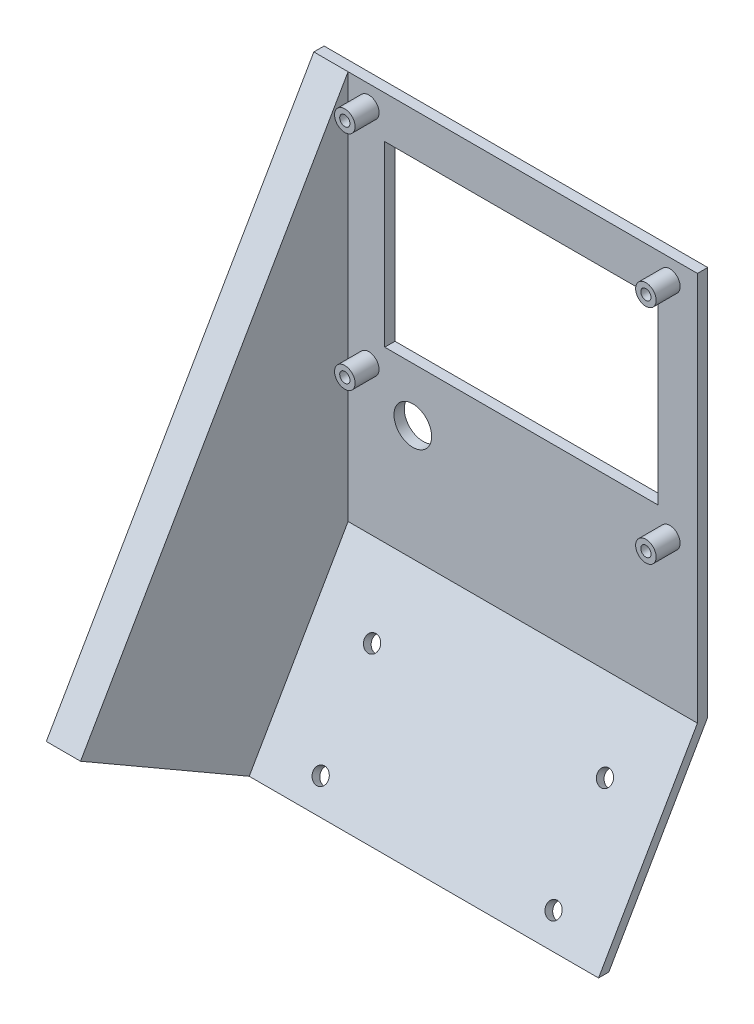
ISO-10303-21;
HEADER;
FILE_DESCRIPTION(('STEP AP214'),'2;1');
FILE_NAME('part.step','',(''),(''),'','','');
FILE_SCHEMA(('AUTOMOTIVE_DESIGN { 1 0 10303 214 1 1 1 1 }'));
ENDSEC;
DATA;
#1=APPLICATION_CONTEXT('core data for automotive mechanical design processes');
#2=APPLICATION_PROTOCOL_DEFINITION('international standard','automotive_design',2000,#1);
#3=PRODUCT_CONTEXT('',#1,'mechanical');
#4=PRODUCT('Part','Part','',(#3));
#5=PRODUCT_RELATED_PRODUCT_CATEGORY('part','',(#4));
#6=PRODUCT_DEFINITION_FORMATION('','',#4);
#7=PRODUCT_DEFINITION_CONTEXT('part definition',#1,'design');
#8=PRODUCT_DEFINITION('design','',#6,#7);
#9=PRODUCT_DEFINITION_SHAPE('','',#8);
#10=(LENGTH_UNIT() NAMED_UNIT(*) SI_UNIT(.MILLI.,.METRE.));
#11=(NAMED_UNIT(*) PLANE_ANGLE_UNIT() SI_UNIT($,.RADIAN.));
#12=(NAMED_UNIT(*) SI_UNIT($,.STERADIAN.) SOLID_ANGLE_UNIT());
#13=UNCERTAINTY_MEASURE_WITH_UNIT(LENGTH_MEASURE(1.E-05),#10,'distance_accuracy_value','');
#14=(GEOMETRIC_REPRESENTATION_CONTEXT(3) GLOBAL_UNCERTAINTY_ASSIGNED_CONTEXT((#13)) GLOBAL_UNIT_ASSIGNED_CONTEXT((#10,
#11,#12)) REPRESENTATION_CONTEXT('',''));
#15=CARTESIAN_POINT('',(0.,0.,0.));
#16=DIRECTION('',(0.,0.,1.));
#17=DIRECTION('',(1.,0.,0.));
#18=AXIS2_PLACEMENT_3D('',#15,#16,#17);
#19=CARTESIAN_POINT('',(90.5,0.,3.));
#20=DIRECTION('',(1.,0.,0.));
#21=DIRECTION('',(0.,1.,0.));
#22=AXIS2_PLACEMENT_3D('',#19,#20,#21);
#23=PLANE('',#22);
#24=DIRECTION('',(0.,-1.,0.));
#25=VECTOR('',#24,1.);
#26=CARTESIAN_POINT('',(90.5,0.,0.));
#27=LINE('',#26,#25);
#28=CARTESIAN_POINT('',(90.5,101.42,0.));
#29=VERTEX_POINT('',#28);
#30=CARTESIAN_POINT('',(90.5,49.42,0.));
#31=VERTEX_POINT('',#30);
#32=EDGE_CURVE('E154',#29,#31,#27,.T.);
#33=ORIENTED_EDGE('',*,*,#32,.T.);
#34=DIRECTION('',(0.,0.,-1.));
#35=VECTOR('',#34,1.);
#36=CARTESIAN_POINT('',(90.5,49.42,3.));
#37=LINE('',#36,#35);
#38=CARTESIAN_POINT('',(90.5,49.42,3.));
#39=VERTEX_POINT('',#38);
#40=EDGE_CURVE('E82',#39,#31,#37,.T.);
#41=ORIENTED_EDGE('',*,*,#40,.F.);
#42=DIRECTION('',(0.,-1.,0.));
#43=VECTOR('',#42,1.);
#44=CARTESIAN_POINT('',(90.5,0.,3.));
#45=LINE('',#44,#43);
#46=CARTESIAN_POINT('',(90.5,101.42,3.));
#47=VERTEX_POINT('',#46);
#48=EDGE_CURVE('E142',#47,#39,#45,.T.);
#49=ORIENTED_EDGE('',*,*,#48,.F.);
#50=DIRECTION('',(0.,0.,-1.));
#51=VECTOR('',#50,1.);
#52=CARTESIAN_POINT('',(90.5,101.42,3.));
#53=LINE('',#52,#51);
#54=EDGE_CURVE('E12',#47,#29,#53,.T.);
#55=ORIENTED_EDGE('',*,*,#54,.T.);
#56=EDGE_LOOP('',(#33,#41,#49,#55));
#57=FACE_BOUND('',#56,.T.);
#58=ADVANCED_FACE('F71',(#57),#23,.F.);
#59=CARTESIAN_POINT('',(0.,49.42,3.));
#60=DIRECTION('',(0.,1.,0.));
#61=DIRECTION('',(0.,0.,1.));
#62=AXIS2_PLACEMENT_3D('',#59,#60,#61);
#63=PLANE('',#62);
#64=DIRECTION('',(1.,0.,0.));
#65=VECTOR('',#64,1.);
#66=CARTESIAN_POINT('',(0.,49.42,0.));
#67=LINE('',#66,#65);
#68=CARTESIAN_POINT('',(10.7,49.42,0.));
#69=VERTEX_POINT('',#68);
#70=EDGE_CURVE('E190',#69,#31,#67,.T.);
#71=ORIENTED_EDGE('',*,*,#70,.F.);
#72=DIRECTION('',(0.,0.,-1.));
#73=VECTOR('',#72,1.);
#74=CARTESIAN_POINT('',(10.7,49.42,3.));
#75=LINE('',#74,#73);
#76=CARTESIAN_POINT('',(10.7,49.42,3.));
#77=VERTEX_POINT('',#76);
#78=EDGE_CURVE('E112',#77,#69,#75,.T.);
#79=ORIENTED_EDGE('',*,*,#78,.F.);
#80=DIRECTION('',(1.,0.,0.));
#81=VECTOR('',#80,1.);
#82=CARTESIAN_POINT('',(0.,49.42,3.));
#83=LINE('',#82,#81);
#84=EDGE_CURVE('E147',#77,#39,#83,.T.);
#85=ORIENTED_EDGE('',*,*,#84,.T.);
#86=ORIENTED_EDGE('',*,*,#40,.T.);
#87=EDGE_LOOP('',(#71,#79,#85,#86));
#88=FACE_BOUND('',#87,.T.);
#89=ADVANCED_FACE('F159',(#88),#63,.T.);
#90=CARTESIAN_POINT('',(10.7,0.,3.));
#91=DIRECTION('',(1.,0.,0.));
#92=DIRECTION('',(0.,1.,0.));
#93=AXIS2_PLACEMENT_3D('',#90,#91,#92);
#94=PLANE('',#93);
#95=DIRECTION('',(0.,-1.,0.));
#96=VECTOR('',#95,1.);
#97=CARTESIAN_POINT('',(10.7,0.,0.));
#98=LINE('',#97,#96);
#99=CARTESIAN_POINT('',(10.7,101.42,0.));
#100=VERTEX_POINT('',#99);
#101=EDGE_CURVE('E193',#100,#69,#98,.T.);
#102=ORIENTED_EDGE('',*,*,#101,.F.);
#103=DIRECTION('',(0.,0.,-1.));
#104=VECTOR('',#103,1.);
#105=CARTESIAN_POINT('',(10.7,101.42,3.));
#106=LINE('',#105,#104);
#107=CARTESIAN_POINT('',(10.7,101.42,3.));
#108=VERTEX_POINT('',#107);
#109=EDGE_CURVE('E91',#108,#100,#106,.T.);
#110=ORIENTED_EDGE('',*,*,#109,.F.);
#111=DIRECTION('',(0.,-1.,0.));
#112=VECTOR('',#111,1.);
#113=CARTESIAN_POINT('',(10.7,0.,3.));
#114=LINE('',#113,#112);
#115=EDGE_CURVE('E161',#108,#77,#114,.T.);
#116=ORIENTED_EDGE('',*,*,#115,.T.);
#117=ORIENTED_EDGE('',*,*,#78,.T.);
#118=EDGE_LOOP('',(#102,#110,#116,#117));
#119=FACE_BOUND('',#118,.T.);
#120=ADVANCED_FACE('F453',(#119),#94,.T.);
#121=CARTESIAN_POINT('',(0.,101.42,3.));
#122=DIRECTION('',(0.,1.,0.));
#123=DIRECTION('',(0.,0.,1.));
#124=AXIS2_PLACEMENT_3D('',#121,#122,#123);
#125=PLANE('',#124);
#126=DIRECTION('',(1.,0.,0.));
#127=VECTOR('',#126,1.);
#128=CARTESIAN_POINT('',(0.,101.42,0.));
#129=LINE('',#128,#127);
#130=EDGE_CURVE('E185',#100,#29,#129,.T.);
#131=ORIENTED_EDGE('',*,*,#130,.T.);
#132=ORIENTED_EDGE('',*,*,#54,.F.);
#133=DIRECTION('',(1.,0.,0.));
#134=VECTOR('',#133,1.);
#135=CARTESIAN_POINT('',(0.,101.42,3.));
#136=LINE('',#135,#134);
#137=EDGE_CURVE('E148',#108,#47,#136,.T.);
#138=ORIENTED_EDGE('',*,*,#137,.F.);
#139=ORIENTED_EDGE('',*,*,#109,.T.);
#140=EDGE_LOOP('',(#131,#132,#138,#139));
#141=FACE_BOUND('',#140,.T.);
#142=ADVANCED_FACE('F457',(#141),#125,.F.);
#143=CARTESIAN_POINT('',(102.,0.,3.));
#144=DIRECTION('',(-1.,0.,0.));
#145=DIRECTION('',(0.,0.,1.));
#146=AXIS2_PLACEMENT_3D('',#143,#144,#145);
#147=PLANE('',#146);
#148=DIRECTION('',(0.,1.,0.));
#149=VECTOR('',#148,1.);
#150=CARTESIAN_POINT('',(102.,0.,0.));
#151=LINE('',#150,#149);
#152=CARTESIAN_POINT('',(102.,0.,0.));
#153=VERTEX_POINT('',#152);
#154=CARTESIAN_POINT('',(102.,113.73,0.));
#155=VERTEX_POINT('',#154);
#156=EDGE_CURVE('E181',#153,#155,#151,.T.);
#157=ORIENTED_EDGE('',*,*,#156,.T.);
#158=DIRECTION('',(0.,0.,-1.));
#159=VECTOR('',#158,1.);
#160=CARTESIAN_POINT('',(102.,113.73,3.));
#161=LINE('',#160,#159);
#162=CARTESIAN_POINT('',(102.,113.73,3.));
#163=VERTEX_POINT('',#162);
#164=EDGE_CURVE('E164',#163,#155,#161,.T.);
#165=ORIENTED_EDGE('',*,*,#164,.F.);
#166=DIRECTION('',(0.,1.,0.));
#167=VECTOR('',#166,1.);
#168=CARTESIAN_POINT('',(102.,0.,3.));
#169=LINE('',#168,#167);
#170=CARTESIAN_POINT('',(102.,0.,3.));
#171=VERTEX_POINT('',#170);
#172=EDGE_CURVE('E321',#171,#163,#169,.T.);
#173=ORIENTED_EDGE('',*,*,#172,.F.);
#174=DIRECTION('',(0.,-0.866025403784442,0.499999999999994));
#175=VECTOR('',#174,1.);
#176=CARTESIAN_POINT('',(102.,0.,3.));
#177=LINE('',#176,#175);
#178=CARTESIAN_POINT('',(102.,-50.,31.8675134594809));
#179=VERTEX_POINT('',#178);
#180=EDGE_CURVE('E229',#171,#179,#177,.T.);
#181=ORIENTED_EDGE('',*,*,#180,.T.);
#182=DIRECTION('',(0.,0.,-1.));
#183=VECTOR('',#182,1.);
#184=CARTESIAN_POINT('',(102.,-50.,31.8675134594809));
#185=LINE('',#184,#183);
#186=CARTESIAN_POINT('',(102.,-50.,28.8675134594809));
#187=VERTEX_POINT('',#186);
#188=EDGE_CURVE('E234',#179,#187,#185,.T.);
#189=ORIENTED_EDGE('',*,*,#188,.T.);
#190=DIRECTION('',(0.,0.866025403784442,-0.499999999999994));
#191=VECTOR('',#190,1.);
#192=CARTESIAN_POINT('',(102.,0.,0.));
#193=LINE('',#192,#191);
#194=EDGE_CURVE('E240',#187,#153,#193,.T.);
#195=ORIENTED_EDGE('',*,*,#194,.T.);
#196=EDGE_LOOP('',(#157,#165,#173,#181,#189,#195));
#197=FACE_BOUND('',#196,.T.);
#198=ADVANCED_FACE('F421',(#197),#147,.F.);
#199=CARTESIAN_POINT('',(0.,113.73,3.));
#200=DIRECTION('',(0.,1.,0.));
#201=DIRECTION('',(0.,0.,1.));
#202=AXIS2_PLACEMENT_3D('',#199,#200,#201);
#203=PLANE('',#202);
#204=DIRECTION('',(1.,0.,0.));
#205=VECTOR('',#204,1.);
#206=CARTESIAN_POINT('',(0.,113.73,0.));
#207=LINE('',#206,#205);
#208=CARTESIAN_POINT('',(-10.,113.73,0.));
#209=VERTEX_POINT('',#208);
#210=EDGE_CURVE('E172',#209,#155,#207,.T.);
#211=ORIENTED_EDGE('',*,*,#210,.F.);
#212=DIRECTION('',(0.,0.,-1.));
#213=VECTOR('',#212,1.);
#214=CARTESIAN_POINT('',(-10.,113.73,3.));
#215=LINE('',#214,#213);
#216=CARTESIAN_POINT('',(-10.,113.73,3.));
#217=VERTEX_POINT('',#216);
#218=EDGE_CURVE('E360',#217,#209,#215,.T.);
#219=ORIENTED_EDGE('',*,*,#218,.F.);
#220=DIRECTION('',(1.,0.,0.));
#221=VECTOR('',#220,1.);
#222=CARTESIAN_POINT('',(-10.,113.73,3.));
#223=LINE('',#222,#221);
#224=CARTESIAN_POINT('',(0.,113.73,3.));
#225=VERTEX_POINT('',#224);
#226=EDGE_CURVE('E351',#217,#225,#223,.T.);
#227=ORIENTED_EDGE('',*,*,#226,.T.);
#228=DIRECTION('',(1.,0.,0.));
#229=VECTOR('',#228,1.);
#230=CARTESIAN_POINT('',(0.,113.73,3.));
#231=LINE('',#230,#229);
#232=EDGE_CURVE('E312',#225,#163,#231,.T.);
#233=ORIENTED_EDGE('',*,*,#232,.T.);
#234=ORIENTED_EDGE('',*,*,#164,.T.);
#235=EDGE_LOOP('',(#211,#219,#227,#233,#234));
#236=FACE_BOUND('',#235,.T.);
#237=ADVANCED_FACE('F400',(#236),#203,.T.);
#238=CARTESIAN_POINT('',(18.9,33.699,3.));
#239=DIRECTION('',(0.,0.,-1.));
#240=DIRECTION('',(-1.,0.,0.));
#241=AXIS2_PLACEMENT_3D('',#238,#239,#240);
#242=CYLINDRICAL_SURFACE('',#241,5.5);
#243=CARTESIAN_POINT('',(18.9,33.699,3.));
#244=DIRECTION('',(0.,0.,1.));
#245=DIRECTION('',(1.,0.,0.));
#246=AXIS2_PLACEMENT_3D('',#243,#244,#245);
#247=CIRCLE('',#246,5.5);
#248=CARTESIAN_POINT('',(24.4,33.699,3.));
#249=VERTEX_POINT('',#248);
#250=EDGE_CURVE('E197',#249,#249,#247,.T.);
#251=ORIENTED_EDGE('',*,*,#250,.T.);
#252=EDGE_LOOP('',(#251));
#253=FACE_BOUND('',#252,.T.);
#254=CARTESIAN_POINT('',(18.9,33.699,0.));
#255=DIRECTION('',(0.,0.,1.));
#256=DIRECTION('',(1.,0.,0.));
#257=AXIS2_PLACEMENT_3D('',#254,#255,#256);
#258=CIRCLE('',#257,5.5);
#259=CARTESIAN_POINT('',(24.4,33.699,0.));
#260=VERTEX_POINT('',#259);
#261=EDGE_CURVE('E168',#260,#260,#258,.T.);
#262=ORIENTED_EDGE('',*,*,#261,.F.);
#263=EDGE_LOOP('',(#262));
#264=FACE_BOUND('',#263,.T.);
#265=ADVANCED_FACE('F73',(#253,#264),#242,.F.);
#266=CARTESIAN_POINT('',(0.,0.,0.));
#267=DIRECTION('',(0.,0.,1.));
#268=DIRECTION('',(1.,0.,0.));
#269=AXIS2_PLACEMENT_3D('',#266,#267,#268);
#270=PLANE('',#269);
#271=ORIENTED_EDGE('',*,*,#261,.T.);
#272=EDGE_LOOP('',(#271));
#273=FACE_BOUND('',#272,.T.);
#274=ORIENTED_EDGE('',*,*,#210,.T.);
#275=ORIENTED_EDGE('',*,*,#156,.F.);
#276=DIRECTION('',(1.,0.,0.));
#277=VECTOR('',#276,1.);
#278=CARTESIAN_POINT('',(0.,0.,0.));
#279=LINE('',#278,#277);
#280=CARTESIAN_POINT('',(-10.,0.,0.));
#281=VERTEX_POINT('',#280);
#282=EDGE_CURVE('E177',#281,#153,#279,.T.);
#283=ORIENTED_EDGE('',*,*,#282,.F.);
#284=DIRECTION('',(0.,-1.,0.));
#285=VECTOR('',#284,1.);
#286=CARTESIAN_POINT('',(-10.,113.73,0.));
#287=LINE('',#286,#285);
#288=EDGE_CURVE('E380',#209,#281,#287,.T.);
#289=ORIENTED_EDGE('',*,*,#288,.F.);
#290=EDGE_LOOP('',(#274,#275,#283,#289));
#291=FACE_BOUND('',#290,.T.);
#292=ORIENTED_EDGE('',*,*,#130,.F.);
#293=ORIENTED_EDGE('',*,*,#101,.T.);
#294=ORIENTED_EDGE('',*,*,#70,.T.);
#295=ORIENTED_EDGE('',*,*,#32,.F.);
#296=EDGE_LOOP('',(#292,#293,#294,#295));
#297=FACE_BOUND('',#296,.T.);
#298=ADVANCED_FACE('F427',(#273,#291,#297),#270,.F.);
#299=CARTESIAN_POINT('',(0.,0.,3.));
#300=DIRECTION('',(0.,0.,1.));
#301=DIRECTION('',(1.,0.,0.));
#302=AXIS2_PLACEMENT_3D('',#299,#300,#301);
#303=PLANE('',#302);
#304=CARTESIAN_POINT('',(93.95,107.87,3.));
#305=DIRECTION('',(0.,0.,1.));
#306=DIRECTION('',(1.,0.,0.));
#307=AXIS2_PLACEMENT_3D('',#304,#305,#306);
#308=CIRCLE('',#307,3.00000000000001);
#309=CARTESIAN_POINT('',(96.95,107.87,3.));
#310=VERTEX_POINT('',#309);
#311=EDGE_CURVE('E208',#310,#310,#308,.F.);
#312=ORIENTED_EDGE('',*,*,#311,.T.);
#313=EDGE_LOOP('',(#312));
#314=FACE_BOUND('',#313,.T.);
#315=CARTESIAN_POINT('',(6.05,107.87,3.));
#316=DIRECTION('',(0.,0.,1.));
#317=DIRECTION('',(1.,0.,0.));
#318=AXIS2_PLACEMENT_3D('',#315,#316,#317);
#319=CIRCLE('',#318,3.);
#320=CARTESIAN_POINT('',(9.05,107.87,3.));
#321=VERTEX_POINT('',#320);
#322=EDGE_CURVE('E173',#321,#321,#319,.F.);
#323=ORIENTED_EDGE('',*,*,#322,.T.);
#324=EDGE_LOOP('',(#323));
#325=FACE_BOUND('',#324,.T.);
#326=ORIENTED_EDGE('',*,*,#250,.F.);
#327=EDGE_LOOP('',(#326));
#328=FACE_BOUND('',#327,.T.);
#329=CARTESIAN_POINT('',(93.95,42.97,3.));
#330=DIRECTION('',(0.,0.,1.));
#331=DIRECTION('',(1.,0.,0.));
#332=AXIS2_PLACEMENT_3D('',#329,#330,#331);
#333=CIRCLE('',#332,3.00000000000001);
#334=CARTESIAN_POINT('',(96.95,42.97,3.));
#335=VERTEX_POINT('',#334);
#336=EDGE_CURVE('E304',#335,#335,#333,.T.);
#337=ORIENTED_EDGE('',*,*,#336,.F.);
#338=EDGE_LOOP('',(#337));
#339=FACE_BOUND('',#338,.T.);
#340=CARTESIAN_POINT('',(6.05,42.97,3.));
#341=DIRECTION('',(0.,0.,1.));
#342=DIRECTION('',(1.,0.,0.));
#343=AXIS2_PLACEMENT_3D('',#340,#341,#342);
#344=CIRCLE('',#343,3.);
#345=CARTESIAN_POINT('',(9.05,42.97,3.));
#346=VERTEX_POINT('',#345);
#347=EDGE_CURVE('E308',#346,#346,#344,.T.);
#348=ORIENTED_EDGE('',*,*,#347,.F.);
#349=EDGE_LOOP('',(#348));
#350=FACE_BOUND('',#349,.T.);
#351=ORIENTED_EDGE('',*,*,#232,.F.);
#352=DIRECTION('',(0.,1.,0.));
#353=VECTOR('',#352,1.);
#354=CARTESIAN_POINT('',(0.,0.,3.));
#355=LINE('',#354,#353);
#356=CARTESIAN_POINT('',(0.,0.,3.));
#357=VERTEX_POINT('',#356);
#358=EDGE_CURVE('E125',#357,#225,#355,.T.);
#359=ORIENTED_EDGE('',*,*,#358,.F.);
#360=DIRECTION('',(1.,0.,0.));
#361=VECTOR('',#360,1.);
#362=CARTESIAN_POINT('',(0.,0.,3.));
#363=LINE('',#362,#361);
#364=EDGE_CURVE('E318',#357,#171,#363,.T.);
#365=ORIENTED_EDGE('',*,*,#364,.T.);
#366=ORIENTED_EDGE('',*,*,#172,.T.);
#367=EDGE_LOOP('',(#351,#359,#365,#366));
#368=FACE_BOUND('',#367,.T.);
#369=ORIENTED_EDGE('',*,*,#137,.T.);
#370=ORIENTED_EDGE('',*,*,#48,.T.);
#371=ORIENTED_EDGE('',*,*,#84,.F.);
#372=ORIENTED_EDGE('',*,*,#115,.F.);
#373=EDGE_LOOP('',(#369,#370,#371,#372));
#374=FACE_BOUND('',#373,.T.);
#375=ADVANCED_FACE('F144',(#314,#325,#328,#339,#350,#368,#374),#303,.T.);
#376=CARTESIAN_POINT('',(6.05,107.87,10.));
#377=DIRECTION('',(0.,0.,-1.));
#378=DIRECTION('',(-1.,0.,0.));
#379=AXIS2_PLACEMENT_3D('',#376,#377,#378);
#380=CYLINDRICAL_SURFACE('',#379,3.);
#381=ORIENTED_EDGE('',*,*,#322,.F.);
#382=EDGE_LOOP('',(#381));
#383=FACE_BOUND('',#382,.T.);
#384=CARTESIAN_POINT('',(6.05,107.87,10.));
#385=DIRECTION('',(0.,0.,1.));
#386=DIRECTION('',(1.,0.,0.));
#387=AXIS2_PLACEMENT_3D('',#384,#385,#386);
#388=CIRCLE('',#387,3.);
#389=CARTESIAN_POINT('',(9.05,107.87,10.));
#390=VERTEX_POINT('',#389);
#391=EDGE_CURVE('E207',#390,#390,#388,.T.);
#392=ORIENTED_EDGE('',*,*,#391,.F.);
#393=EDGE_LOOP('',(#392));
#394=FACE_BOUND('',#393,.T.);
#395=ADVANCED_FACE('F477',(#383,#394),#380,.T.);
#396=CARTESIAN_POINT('',(6.05,107.87,10.));
#397=DIRECTION('',(0.,0.,1.));
#398=DIRECTION('',(1.,0.,0.));
#399=AXIS2_PLACEMENT_3D('',#396,#397,#398);
#400=PLANE('',#399);
#401=CARTESIAN_POINT('',(6.05,107.87,10.));
#402=DIRECTION('',(0.,0.,1.));
#403=DIRECTION('',(1.,0.,0.));
#404=AXIS2_PLACEMENT_3D('',#401,#402,#403);
#405=CIRCLE('',#404,1.5);
#406=CARTESIAN_POINT('',(7.55,107.87,10.));
#407=VERTEX_POINT('',#406);
#408=EDGE_CURVE('E266',#407,#407,#405,.T.);
#409=ORIENTED_EDGE('',*,*,#408,.F.);
#410=EDGE_LOOP('',(#409));
#411=FACE_BOUND('',#410,.T.);
#412=ORIENTED_EDGE('',*,*,#391,.T.);
#413=EDGE_LOOP('',(#412));
#414=FACE_BOUND('',#413,.T.);
#415=ADVANCED_FACE('F494',(#411,#414),#400,.T.);
#416=CARTESIAN_POINT('',(6.05,42.97,10.));
#417=DIRECTION('',(0.,0.,1.));
#418=DIRECTION('',(1.,0.,0.));
#419=AXIS2_PLACEMENT_3D('',#416,#417,#418);
#420=PLANE('',#419);
#421=CARTESIAN_POINT('',(6.05,42.97,10.));
#422=DIRECTION('',(0.,0.,1.));
#423=DIRECTION('',(1.,0.,0.));
#424=AXIS2_PLACEMENT_3D('',#421,#422,#423);
#425=CIRCLE('',#424,1.5);
#426=CARTESIAN_POINT('',(7.55,42.97,10.));
#427=VERTEX_POINT('',#426);
#428=EDGE_CURVE('E253',#427,#427,#425,.T.);
#429=ORIENTED_EDGE('',*,*,#428,.F.);
#430=EDGE_LOOP('',(#429));
#431=FACE_BOUND('',#430,.T.);
#432=CARTESIAN_POINT('',(6.05,42.97,10.));
#433=DIRECTION('',(0.,0.,1.));
#434=DIRECTION('',(1.,0.,0.));
#435=AXIS2_PLACEMENT_3D('',#432,#433,#434);
#436=CIRCLE('',#435,3.);
#437=CARTESIAN_POINT('',(9.05,42.97,10.));
#438=VERTEX_POINT('',#437);
#439=EDGE_CURVE('E294',#438,#438,#436,.T.);
#440=ORIENTED_EDGE('',*,*,#439,.T.);
#441=EDGE_LOOP('',(#440));
#442=FACE_BOUND('',#441,.T.);
#443=ADVANCED_FACE('F489',(#431,#442),#420,.T.);
#444=CARTESIAN_POINT('',(6.05,42.97,10.));
#445=DIRECTION('',(0.,0.,-1.));
#446=DIRECTION('',(-1.,0.,0.));
#447=AXIS2_PLACEMENT_3D('',#444,#445,#446);
#448=CYLINDRICAL_SURFACE('',#447,3.);
#449=ORIENTED_EDGE('',*,*,#347,.T.);
#450=EDGE_LOOP('',(#449));
#451=FACE_BOUND('',#450,.T.);
#452=ORIENTED_EDGE('',*,*,#439,.F.);
#453=EDGE_LOOP('',(#452));
#454=FACE_BOUND('',#453,.T.);
#455=ADVANCED_FACE('F485',(#451,#454),#448,.T.);
#456=CARTESIAN_POINT('',(93.95,42.97,10.));
#457=DIRECTION('',(0.,0.,1.));
#458=DIRECTION('',(1.,0.,0.));
#459=AXIS2_PLACEMENT_3D('',#456,#457,#458);
#460=PLANE('',#459);
#461=CARTESIAN_POINT('',(93.95,42.97,10.));
#462=DIRECTION('',(0.,0.,1.));
#463=DIRECTION('',(1.,0.,0.));
#464=AXIS2_PLACEMENT_3D('',#461,#462,#463);
#465=CIRCLE('',#464,1.5);
#466=CARTESIAN_POINT('',(95.45,42.97,10.));
#467=VERTEX_POINT('',#466);
#468=EDGE_CURVE('E267',#467,#467,#465,.T.);
#469=ORIENTED_EDGE('',*,*,#468,.F.);
#470=EDGE_LOOP('',(#469));
#471=FACE_BOUND('',#470,.T.);
#472=CARTESIAN_POINT('',(93.95,42.97,10.));
#473=DIRECTION('',(0.,0.,1.));
#474=DIRECTION('',(1.,0.,0.));
#475=AXIS2_PLACEMENT_3D('',#472,#473,#474);
#476=CIRCLE('',#475,3.00000000000001);
#477=CARTESIAN_POINT('',(96.95,42.97,10.));
#478=VERTEX_POINT('',#477);
#479=EDGE_CURVE('E212',#478,#478,#476,.T.);
#480=ORIENTED_EDGE('',*,*,#479,.T.);
#481=EDGE_LOOP('',(#480));
#482=FACE_BOUND('',#481,.T.);
#483=ADVANCED_FACE('F488',(#471,#482),#460,.T.);
#484=CARTESIAN_POINT('',(93.95,42.97,10.));
#485=DIRECTION('',(0.,0.,-1.));
#486=DIRECTION('',(-1.,0.,0.));
#487=AXIS2_PLACEMENT_3D('',#484,#485,#486);
#488=CYLINDRICAL_SURFACE('',#487,3.00000000000001);
#489=ORIENTED_EDGE('',*,*,#336,.T.);
#490=EDGE_LOOP('',(#489));
#491=FACE_BOUND('',#490,.T.);
#492=ORIENTED_EDGE('',*,*,#479,.F.);
#493=EDGE_LOOP('',(#492));
#494=FACE_BOUND('',#493,.T.);
#495=ADVANCED_FACE('F677',(#491,#494),#488,.T.);
#496=CARTESIAN_POINT('',(93.95,107.87,10.));
#497=DIRECTION('',(0.,0.,-1.));
#498=DIRECTION('',(-1.,0.,0.));
#499=AXIS2_PLACEMENT_3D('',#496,#497,#498);
#500=CYLINDRICAL_SURFACE('',#499,3.00000000000001);
#501=ORIENTED_EDGE('',*,*,#311,.F.);
#502=EDGE_LOOP('',(#501));
#503=FACE_BOUND('',#502,.T.);
#504=CARTESIAN_POINT('',(93.95,107.87,10.));
#505=DIRECTION('',(0.,0.,1.));
#506=DIRECTION('',(1.,0.,0.));
#507=AXIS2_PLACEMENT_3D('',#504,#505,#506);
#508=CIRCLE('',#507,3.00000000000001);
#509=CARTESIAN_POINT('',(96.95,107.87,10.));
#510=VERTEX_POINT('',#509);
#511=EDGE_CURVE('E213',#510,#510,#508,.T.);
#512=ORIENTED_EDGE('',*,*,#511,.F.);
#513=EDGE_LOOP('',(#512));
#514=FACE_BOUND('',#513,.T.);
#515=ADVANCED_FACE('F674',(#503,#514),#500,.T.);
#516=CARTESIAN_POINT('',(93.95,107.87,10.));
#517=DIRECTION('',(0.,0.,1.));
#518=DIRECTION('',(1.,0.,0.));
#519=AXIS2_PLACEMENT_3D('',#516,#517,#518);
#520=PLANE('',#519);
#521=CARTESIAN_POINT('',(93.95,107.87,10.));
#522=DIRECTION('',(0.,0.,1.));
#523=DIRECTION('',(1.,0.,0.));
#524=AXIS2_PLACEMENT_3D('',#521,#522,#523);
#525=CIRCLE('',#524,1.5);
#526=CARTESIAN_POINT('',(95.45,107.87,10.));
#527=VERTEX_POINT('',#526);
#528=EDGE_CURVE('E257',#527,#527,#525,.T.);
#529=ORIENTED_EDGE('',*,*,#528,.F.);
#530=EDGE_LOOP('',(#529));
#531=FACE_BOUND('',#530,.T.);
#532=ORIENTED_EDGE('',*,*,#511,.T.);
#533=EDGE_LOOP('',(#532));
#534=FACE_BOUND('',#533,.T.);
#535=ADVANCED_FACE('F651',(#531,#534),#520,.T.);
#536=CARTESIAN_POINT('',(93.95,107.87,-1.24264068711929));
#537=DIRECTION('',(0.,0.,1.));
#538=DIRECTION('',(1.,0.,0.));
#539=AXIS2_PLACEMENT_3D('',#536,#537,#538);
#540=CYLINDRICAL_SURFACE('',#539,1.5);
#541=CARTESIAN_POINT('',(93.95,107.87,3.));
#542=DIRECTION('',(0.,0.,1.));
#543=DIRECTION('',(1.,0.,0.));
#544=AXIS2_PLACEMENT_3D('',#541,#542,#543);
#545=CIRCLE('',#544,1.5);
#546=CARTESIAN_POINT('',(95.45,107.87,3.));
#547=VERTEX_POINT('',#546);
#548=EDGE_CURVE('E261',#547,#547,#545,.F.);
#549=ORIENTED_EDGE('',*,*,#548,.T.);
#550=EDGE_LOOP('',(#549));
#551=FACE_BOUND('',#550,.T.);
#552=ORIENTED_EDGE('',*,*,#528,.T.);
#553=EDGE_LOOP('',(#552));
#554=FACE_BOUND('',#553,.T.);
#555=ADVANCED_FACE('F647',(#551,#554),#540,.F.);
#556=CARTESIAN_POINT('',(0.,0.,3.));
#557=DIRECTION('',(0.,0.,1.));
#558=DIRECTION('',(1.,0.,0.));
#559=AXIS2_PLACEMENT_3D('',#556,#557,#558);
#560=PLANE('',#559);
#561=ORIENTED_EDGE('',*,*,#548,.F.);
#562=EDGE_LOOP('',(#561));
#563=FACE_BOUND('',#562,.T.);
#564=ADVANCED_FACE('F643',(#563),#560,.T.);
#565=CARTESIAN_POINT('',(93.95,42.97,-1.24264068711929));
#566=DIRECTION('',(0.,0.,1.));
#567=DIRECTION('',(1.,0.,0.));
#568=AXIS2_PLACEMENT_3D('',#565,#566,#567);
#569=CYLINDRICAL_SURFACE('',#568,1.5);
#570=CARTESIAN_POINT('',(93.95,42.97,3.));
#571=DIRECTION('',(0.,0.,1.));
#572=DIRECTION('',(1.,0.,0.));
#573=AXIS2_PLACEMENT_3D('',#570,#571,#572);
#574=CIRCLE('',#573,1.5);
#575=CARTESIAN_POINT('',(95.45,42.97,3.));
#576=VERTEX_POINT('',#575);
#577=EDGE_CURVE('E262',#576,#576,#574,.F.);
#578=ORIENTED_EDGE('',*,*,#577,.T.);
#579=EDGE_LOOP('',(#578));
#580=FACE_BOUND('',#579,.T.);
#581=ORIENTED_EDGE('',*,*,#468,.T.);
#582=EDGE_LOOP('',(#581));
#583=FACE_BOUND('',#582,.T.);
#584=ADVANCED_FACE('F646',(#580,#583),#569,.F.);
#585=CARTESIAN_POINT('',(0.,0.,3.));
#586=DIRECTION('',(0.,0.,1.));
#587=DIRECTION('',(1.,0.,0.));
#588=AXIS2_PLACEMENT_3D('',#585,#586,#587);
#589=PLANE('',#588);
#590=ORIENTED_EDGE('',*,*,#577,.F.);
#591=EDGE_LOOP('',(#590));
#592=FACE_BOUND('',#591,.T.);
#593=ADVANCED_FACE('F653',(#592),#589,.T.);
#594=CARTESIAN_POINT('',(6.05,42.97,-1.24264068711929));
#595=DIRECTION('',(0.,0.,1.));
#596=DIRECTION('',(1.,0.,0.));
#597=AXIS2_PLACEMENT_3D('',#594,#595,#596);
#598=CYLINDRICAL_SURFACE('',#597,1.5);
#599=CARTESIAN_POINT('',(6.05,42.97,3.));
#600=DIRECTION('',(0.,0.,1.));
#601=DIRECTION('',(1.,0.,0.));
#602=AXIS2_PLACEMENT_3D('',#599,#600,#601);
#603=CIRCLE('',#602,1.5);
#604=CARTESIAN_POINT('',(7.55,42.97,3.));
#605=VERTEX_POINT('',#604);
#606=EDGE_CURVE('E271',#605,#605,#603,.F.);
#607=ORIENTED_EDGE('',*,*,#606,.T.);
#608=EDGE_LOOP('',(#607));
#609=FACE_BOUND('',#608,.T.);
#610=ORIENTED_EDGE('',*,*,#428,.T.);
#611=EDGE_LOOP('',(#610));
#612=FACE_BOUND('',#611,.T.);
#613=ADVANCED_FACE('F656',(#609,#612),#598,.F.);
#614=CARTESIAN_POINT('',(0.,0.,3.));
#615=DIRECTION('',(0.,0.,1.));
#616=DIRECTION('',(1.,0.,0.));
#617=AXIS2_PLACEMENT_3D('',#614,#615,#616);
#618=PLANE('',#617);
#619=ORIENTED_EDGE('',*,*,#606,.F.);
#620=EDGE_LOOP('',(#619));
#621=FACE_BOUND('',#620,.T.);
#622=ADVANCED_FACE('F661',(#621),#618,.T.);
#623=CARTESIAN_POINT('',(6.05,107.87,-1.24264068711929));
#624=DIRECTION('',(0.,0.,1.));
#625=DIRECTION('',(1.,0.,0.));
#626=AXIS2_PLACEMENT_3D('',#623,#624,#625);
#627=CYLINDRICAL_SURFACE('',#626,1.5);
#628=CARTESIAN_POINT('',(6.05,107.87,3.));
#629=DIRECTION('',(0.,0.,1.));
#630=DIRECTION('',(1.,0.,0.));
#631=AXIS2_PLACEMENT_3D('',#628,#629,#630);
#632=CIRCLE('',#631,1.5);
#633=CARTESIAN_POINT('',(7.55,107.87,3.));
#634=VERTEX_POINT('',#633);
#635=EDGE_CURVE('E284',#634,#634,#632,.F.);
#636=ORIENTED_EDGE('',*,*,#635,.T.);
#637=EDGE_LOOP('',(#636));
#638=FACE_BOUND('',#637,.T.);
#639=ORIENTED_EDGE('',*,*,#408,.T.);
#640=EDGE_LOOP('',(#639));
#641=FACE_BOUND('',#640,.T.);
#642=ADVANCED_FACE('F664',(#638,#641),#627,.F.);
#643=CARTESIAN_POINT('',(0.,0.,3.));
#644=DIRECTION('',(0.,0.,1.));
#645=DIRECTION('',(1.,0.,0.));
#646=AXIS2_PLACEMENT_3D('',#643,#644,#645);
#647=PLANE('',#646);
#648=ORIENTED_EDGE('',*,*,#635,.F.);
#649=EDGE_LOOP('',(#648));
#650=FACE_BOUND('',#649,.T.);
#651=ADVANCED_FACE('F529',(#650),#647,.T.);
#652=CARTESIAN_POINT('',(-59.2919759671593,0.,3.));
#653=DIRECTION('',(0.,0.499999999999994,0.866025403784442));
#654=DIRECTION('',(0.,-0.866025403784442,0.499999999999994));
#655=AXIS2_PLACEMENT_3D('',#652,#653,#654);
#656=PLANE('',#655);
#657=CARTESIAN_POINT('',(17.,-43.3012701892221,27.9999999999997));
#658=DIRECTION('',(0.,0.499999999999994,0.866025403784442));
#659=DIRECTION('',(0.,0.866025403784442,-0.499999999999994));
#660=AXIS2_PLACEMENT_3D('',#657,#658,#659);
#661=CIRCLE('',#660,2.25);
#662=CARTESIAN_POINT('',(17.,-41.3527130307071,26.8749999999997));
#663=VERTEX_POINT('',#662);
#664=EDGE_CURVE('E332',#663,#663,#661,.T.);
#665=ORIENTED_EDGE('',*,*,#664,.F.);
#666=EDGE_LOOP('',(#665));
#667=FACE_BOUND('',#666,.T.);
#668=CARTESIAN_POINT('',(85.,-43.3012701892221,27.9999999999997));
#669=DIRECTION('',(0.,0.499999999999994,0.866025403784442));
#670=DIRECTION('',(0.,0.866025403784442,-0.499999999999994));
#671=AXIS2_PLACEMENT_3D('',#668,#669,#670);
#672=CIRCLE('',#671,2.25);
#673=CARTESIAN_POINT('',(85.,-41.3527130307071,26.8749999999997));
#674=VERTEX_POINT('',#673);
#675=EDGE_CURVE('E336',#674,#674,#672,.T.);
#676=ORIENTED_EDGE('',*,*,#675,.F.);
#677=EDGE_LOOP('',(#676));
#678=FACE_BOUND('',#677,.T.);
#679=CARTESIAN_POINT('',(85.,-17.3205080756888,12.9999999999999));
#680=DIRECTION('',(0.,0.499999999999994,0.866025403784442));
#681=DIRECTION('',(0.,-0.866025403784442,0.499999999999994));
#682=AXIS2_PLACEMENT_3D('',#679,#680,#681);
#683=CIRCLE('',#682,2.25);
#684=CARTESIAN_POINT('',(85.,-19.2690652342038,14.1249999999999));
#685=VERTEX_POINT('',#684);
#686=EDGE_CURVE('E331',#685,#685,#683,.T.);
#687=ORIENTED_EDGE('',*,*,#686,.F.);
#688=EDGE_LOOP('',(#687));
#689=FACE_BOUND('',#688,.T.);
#690=CARTESIAN_POINT('',(17.,-17.3205080756888,12.9999999999999));
#691=DIRECTION('',(0.,0.499999999999994,0.866025403784442));
#692=DIRECTION('',(0.,-0.866025403784442,0.499999999999994));
#693=AXIS2_PLACEMENT_3D('',#690,#691,#692);
#694=CIRCLE('',#693,2.25);
#695=CARTESIAN_POINT('',(17.,-19.2690652342038,14.1249999999999));
#696=VERTEX_POINT('',#695);
#697=EDGE_CURVE('E219',#696,#696,#694,.T.);
#698=ORIENTED_EDGE('',*,*,#697,.F.);
#699=EDGE_LOOP('',(#698));
#700=FACE_BOUND('',#699,.T.);
#701=ORIENTED_EDGE('',*,*,#364,.F.);
#702=DIRECTION('',(0.,-0.866025403784442,0.499999999999994));
#703=VECTOR('',#702,1.);
#704=CARTESIAN_POINT('',(0.,0.,3.));
#705=LINE('',#704,#703);
#706=CARTESIAN_POINT('',(0.,-50.,31.8675134594809));
#707=VERTEX_POINT('',#706);
#708=EDGE_CURVE('E244',#357,#707,#705,.T.);
#709=ORIENTED_EDGE('',*,*,#708,.T.);
#710=DIRECTION('',(1.,0.,0.));
#711=VECTOR('',#710,1.);
#712=CARTESIAN_POINT('',(-59.2919759671593,-50.,31.8675134594809));
#713=LINE('',#712,#711);
#714=EDGE_CURVE('E248',#707,#179,#713,.T.);
#715=ORIENTED_EDGE('',*,*,#714,.T.);
#716=ORIENTED_EDGE('',*,*,#180,.F.);
#717=EDGE_LOOP('',(#701,#709,#715,#716));
#718=FACE_BOUND('',#717,.T.);
#719=ADVANCED_FACE('F417',(#667,#678,#689,#700,#718),#656,.T.);
#720=CARTESIAN_POINT('',(-59.2919759671593,-50.,31.8675134594809));
#721=DIRECTION('',(0.,-1.,0.));
#722=DIRECTION('',(0.,0.,-1.));
#723=AXIS2_PLACEMENT_3D('',#720,#721,#722);
#724=PLANE('',#723);
#725=ORIENTED_EDGE('',*,*,#714,.F.);
#726=DIRECTION('',(1.,0.,0.));
#727=VECTOR('',#726,1.);
#728=CARTESIAN_POINT('',(-10.,-50.,31.8675134594809));
#729=LINE('',#728,#727);
#730=CARTESIAN_POINT('',(-10.,-50.,31.8675134594809));
#731=VERTEX_POINT('',#730);
#732=EDGE_CURVE('E337',#731,#707,#729,.T.);
#733=ORIENTED_EDGE('',*,*,#732,.F.);
#734=DIRECTION('',(0.,0.,1.));
#735=VECTOR('',#734,1.);
#736=CARTESIAN_POINT('',(-10.,-50.,28.8675134594809));
#737=LINE('',#736,#735);
#738=CARTESIAN_POINT('',(-10.,-50.,28.8675134594809));
#739=VERTEX_POINT('',#738);
#740=EDGE_CURVE('E372',#739,#731,#737,.T.);
#741=ORIENTED_EDGE('',*,*,#740,.F.);
#742=DIRECTION('',(1.,0.,0.));
#743=VECTOR('',#742,1.);
#744=CARTESIAN_POINT('',(-59.2919759671593,-50.,28.8675134594809));
#745=LINE('',#744,#743);
#746=EDGE_CURVE('E249',#739,#187,#745,.T.);
#747=ORIENTED_EDGE('',*,*,#746,.T.);
#748=ORIENTED_EDGE('',*,*,#188,.F.);
#749=EDGE_LOOP('',(#725,#733,#741,#747,#748));
#750=FACE_BOUND('',#749,.T.);
#751=ADVANCED_FACE('F420',(#750),#724,.T.);
#752=CARTESIAN_POINT('',(-59.2919759671593,0.,0.));
#753=DIRECTION('',(0.,-0.499999999999994,-0.866025403784442));
#754=DIRECTION('',(0.,0.866025403784442,-0.499999999999994));
#755=AXIS2_PLACEMENT_3D('',#752,#753,#754);
#756=PLANE('',#755);
#757=CARTESIAN_POINT('',(17.,-44.6003082948987,25.7499999999997));
#758=DIRECTION('',(0.,-0.499999999999994,-0.866025403784442));
#759=DIRECTION('',(0.,0.866025403784442,-0.499999999999994));
#760=AXIS2_PLACEMENT_3D('',#757,#758,#759);
#761=CIRCLE('',#760,2.25);
#762=CARTESIAN_POINT('',(17.,-42.6517511363837,24.6249999999997));
#763=VERTEX_POINT('',#762);
#764=EDGE_CURVE('E75',#763,#763,#761,.T.);
#765=ORIENTED_EDGE('',*,*,#764,.F.);
#766=EDGE_LOOP('',(#765));
#767=FACE_BOUND('',#766,.T.);
#768=CARTESIAN_POINT('',(85.,-44.6003082948987,25.7499999999997));
#769=DIRECTION('',(0.,-0.499999999999994,-0.866025403784442));
#770=DIRECTION('',(0.,0.866025403784442,-0.499999999999994));
#771=AXIS2_PLACEMENT_3D('',#768,#769,#770);
#772=CIRCLE('',#771,2.25);
#773=CARTESIAN_POINT('',(85.,-42.6517511363838,24.6249999999997));
#774=VERTEX_POINT('',#773);
#775=EDGE_CURVE('E222',#774,#774,#772,.T.);
#776=ORIENTED_EDGE('',*,*,#775,.F.);
#777=EDGE_LOOP('',(#776));
#778=FACE_BOUND('',#777,.T.);
#779=CARTESIAN_POINT('',(85.,-18.6195461813655,10.7499999999999));
#780=DIRECTION('',(0.,-0.499999999999994,-0.866025403784442));
#781=DIRECTION('',(0.,0.866025403784442,-0.499999999999994));
#782=AXIS2_PLACEMENT_3D('',#779,#780,#781);
#783=CIRCLE('',#782,2.25);
#784=CARTESIAN_POINT('',(85.,-16.6709890228505,9.62499999999989));
#785=VERTEX_POINT('',#784);
#786=EDGE_CURVE('E218',#785,#785,#783,.T.);
#787=ORIENTED_EDGE('',*,*,#786,.F.);
#788=EDGE_LOOP('',(#787));
#789=FACE_BOUND('',#788,.T.);
#790=CARTESIAN_POINT('',(17.,-18.6195461813655,10.7499999999999));
#791=DIRECTION('',(0.,-0.499999999999994,-0.866025403784442));
#792=DIRECTION('',(0.,0.866025403784442,-0.499999999999994));
#793=AXIS2_PLACEMENT_3D('',#790,#791,#792);
#794=CIRCLE('',#793,2.25);
#795=CARTESIAN_POINT('',(17.,-16.6709890228505,9.62499999999988));
#796=VERTEX_POINT('',#795);
#797=EDGE_CURVE('E214',#796,#796,#794,.T.);
#798=ORIENTED_EDGE('',*,*,#797,.F.);
#799=EDGE_LOOP('',(#798));
#800=FACE_BOUND('',#799,.T.);
#801=ORIENTED_EDGE('',*,*,#746,.F.);
#802=DIRECTION('',(0.,-0.866025403784442,0.499999999999994));
#803=VECTOR('',#802,1.);
#804=CARTESIAN_POINT('',(-10.,0.,0.));
#805=LINE('',#804,#803);
#806=EDGE_CURVE('E376',#281,#739,#805,.T.);
#807=ORIENTED_EDGE('',*,*,#806,.F.);
#808=ORIENTED_EDGE('',*,*,#282,.T.);
#809=ORIENTED_EDGE('',*,*,#194,.F.);
#810=EDGE_LOOP('',(#801,#807,#808,#809));
#811=FACE_BOUND('',#810,.T.);
#812=ADVANCED_FACE('F423',(#767,#778,#789,#800,#811),#756,.T.);
#813=CARTESIAN_POINT('',(17.,-31.1195461813652,-10.9006350946109));
#814=DIRECTION('',(0.,0.499999999999994,0.866025403784442));
#815=DIRECTION('',(0.,-0.866025403784442,0.499999999999994));
#816=AXIS2_PLACEMENT_3D('',#813,#814,#815);
#817=CYLINDRICAL_SURFACE('',#816,2.25);
#818=ORIENTED_EDGE('',*,*,#797,.T.);
#819=EDGE_LOOP('',(#818));
#820=FACE_BOUND('',#819,.T.);
#821=ORIENTED_EDGE('',*,*,#697,.T.);
#822=EDGE_LOOP('',(#821));
#823=FACE_BOUND('',#822,.T.);
#824=ADVANCED_FACE('F533',(#820,#823),#817,.F.);
#825=CARTESIAN_POINT('',(85.,-31.1195461813652,-10.9006350946109));
#826=DIRECTION('',(0.,0.499999999999994,0.866025403784442));
#827=DIRECTION('',(0.,-0.866025403784442,0.499999999999994));
#828=AXIS2_PLACEMENT_3D('',#825,#826,#827);
#829=CYLINDRICAL_SURFACE('',#828,2.25);
#830=ORIENTED_EDGE('',*,*,#786,.T.);
#831=EDGE_LOOP('',(#830));
#832=FACE_BOUND('',#831,.T.);
#833=ORIENTED_EDGE('',*,*,#686,.T.);
#834=EDGE_LOOP('',(#833));
#835=FACE_BOUND('',#834,.T.);
#836=ADVANCED_FACE('F538',(#832,#835),#829,.F.);
#837=CARTESIAN_POINT('',(85.,-57.1003082948985,4.0993649053889));
#838=DIRECTION('',(0.,0.499999999999994,0.866025403784442));
#839=DIRECTION('',(0.,-0.866025403784442,0.499999999999994));
#840=AXIS2_PLACEMENT_3D('',#837,#838,#839);
#841=CYLINDRICAL_SURFACE('',#840,2.25);
#842=ORIENTED_EDGE('',*,*,#775,.T.);
#843=EDGE_LOOP('',(#842));
#844=FACE_BOUND('',#843,.T.);
#845=ORIENTED_EDGE('',*,*,#675,.T.);
#846=EDGE_LOOP('',(#845));
#847=FACE_BOUND('',#846,.T.);
#848=ADVANCED_FACE('F550',(#844,#847),#841,.F.);
#849=CARTESIAN_POINT('',(17.,-57.1003082948985,4.0993649053889));
#850=DIRECTION('',(0.,0.499999999999994,0.866025403784442));
#851=DIRECTION('',(0.,-0.866025403784442,0.499999999999994));
#852=AXIS2_PLACEMENT_3D('',#849,#850,#851);
#853=CYLINDRICAL_SURFACE('',#852,2.25);
#854=ORIENTED_EDGE('',*,*,#764,.T.);
#855=EDGE_LOOP('',(#854));
#856=FACE_BOUND('',#855,.T.);
#857=ORIENTED_EDGE('',*,*,#664,.T.);
#858=EDGE_LOOP('',(#857));
#859=FACE_BOUND('',#858,.T.);
#860=ADVANCED_FACE('F560',(#856,#859),#853,.F.);
#861=CARTESIAN_POINT('',(-10.,-50.,31.8675134594809));
#862=DIRECTION('',(0.,0.866025403784439,-0.5));
#863=DIRECTION('',(0.,0.5,0.866025403784439));
#864=AXIS2_PLACEMENT_3D('',#861,#862,#863);
#865=PLANE('',#864);
#866=DIRECTION('',(0.,0.5,0.866025403784439));
#867=VECTOR('',#866,1.);
#868=CARTESIAN_POINT('',(0.,-50.,31.8675134594809));
#869=LINE('',#868,#867);
#870=CARTESIAN_POINT('',(0.,-21.5675000000003,81.1140480456825));
#871=VERTEX_POINT('',#870);
#872=EDGE_CURVE('E361',#707,#871,#869,.T.);
#873=ORIENTED_EDGE('',*,*,#872,.T.);
#874=DIRECTION('',(1.,0.,0.));
#875=VECTOR('',#874,1.);
#876=CARTESIAN_POINT('',(-10.,-21.5675000000003,81.1140480456825));
#877=LINE('',#876,#875);
#878=CARTESIAN_POINT('',(-10.,-21.5675000000003,81.1140480456825));
#879=VERTEX_POINT('',#878);
#880=EDGE_CURVE('E347',#879,#871,#877,.T.);
#881=ORIENTED_EDGE('',*,*,#880,.F.);
#882=DIRECTION('',(0.,0.5,0.866025403784439));
#883=VECTOR('',#882,1.);
#884=CARTESIAN_POINT('',(-10.,-50.,31.8675134594809));
#885=LINE('',#884,#883);
#886=EDGE_CURVE('E368',#731,#879,#885,.T.);
#887=ORIENTED_EDGE('',*,*,#886,.F.);
#888=ORIENTED_EDGE('',*,*,#732,.T.);
#889=EDGE_LOOP('',(#873,#881,#887,#888));
#890=FACE_BOUND('',#889,.T.);
#891=ADVANCED_FACE('F435',(#890),#865,.F.);
#892=CARTESIAN_POINT('',(-10.,-21.5675000000003,81.1140480456825));
#893=DIRECTION('',(0.,-0.499999999999995,-0.866025403784442));
#894=DIRECTION('',(0.,0.866025403784442,-0.499999999999995));
#895=AXIS2_PLACEMENT_3D('',#892,#893,#894);
#896=PLANE('',#895);
#897=DIRECTION('',(0.,0.866025403784442,-0.499999999999995));
#898=VECTOR('',#897,1.);
#899=CARTESIAN_POINT('',(0.,-21.5675000000003,81.1140480456825));
#900=LINE('',#899,#898);
#901=EDGE_CURVE('E356',#871,#225,#900,.T.);
#902=ORIENTED_EDGE('',*,*,#901,.T.);
#903=ORIENTED_EDGE('',*,*,#226,.F.);
#904=DIRECTION('',(0.,0.866025403784442,-0.499999999999995));
#905=VECTOR('',#904,1.);
#906=CARTESIAN_POINT('',(-10.,-21.5675000000003,81.1140480456825));
#907=LINE('',#906,#905);
#908=EDGE_CURVE('E355',#879,#217,#907,.T.);
#909=ORIENTED_EDGE('',*,*,#908,.F.);
#910=ORIENTED_EDGE('',*,*,#880,.T.);
#911=EDGE_LOOP('',(#902,#903,#909,#910));
#912=FACE_BOUND('',#911,.T.);
#913=ADVANCED_FACE('F438',(#912),#896,.F.);
#914=CARTESIAN_POINT('',(-10.,0.,0.));
#915=DIRECTION('',(-1.,0.,0.));
#916=DIRECTION('',(0.,0.,1.));
#917=AXIS2_PLACEMENT_3D('',#914,#915,#916);
#918=PLANE('',#917);
#919=ORIENTED_EDGE('',*,*,#218,.T.);
#920=ORIENTED_EDGE('',*,*,#288,.T.);
#921=ORIENTED_EDGE('',*,*,#806,.T.);
#922=ORIENTED_EDGE('',*,*,#740,.T.);
#923=ORIENTED_EDGE('',*,*,#886,.T.);
#924=ORIENTED_EDGE('',*,*,#908,.T.);
#925=EDGE_LOOP('',(#919,#920,#921,#922,#923,#924));
#926=FACE_BOUND('',#925,.T.);
#927=ADVANCED_FACE('F389',(#926),#918,.T.);
#928=CARTESIAN_POINT('',(0.,0.,0.));
#929=DIRECTION('',(-1.,0.,0.));
#930=DIRECTION('',(0.,0.,1.));
#931=AXIS2_PLACEMENT_3D('',#928,#929,#930);
#932=PLANE('',#931);
#933=ORIENTED_EDGE('',*,*,#708,.F.);
#934=ORIENTED_EDGE('',*,*,#358,.T.);
#935=ORIENTED_EDGE('',*,*,#901,.F.);
#936=ORIENTED_EDGE('',*,*,#872,.F.);
#937=EDGE_LOOP('',(#933,#934,#935,#936));
#938=FACE_BOUND('',#937,.T.);
#939=ADVANCED_FACE('F440',(#938),#932,.F.);
#940=CLOSED_SHELL('',(#58,#89,#120,#142,#198,#237,#265,#298,#375,#395,#415,#443,#455,#483,#495,
#515,#535,#555,#564,#584,#593,#613,#622,#642,#651,#719,#751,#812,#824,#836,#848,#860,#891,#913,
#927,#939));
#941=MANIFOLD_SOLID_BREP('B2',#940);
#942=ADVANCED_BREP_SHAPE_REPRESENTATION('',(#18,#941),#14);
#943=SHAPE_DEFINITION_REPRESENTATION(#9,#942);
ENDSEC;
END-ISO-10303-21;
